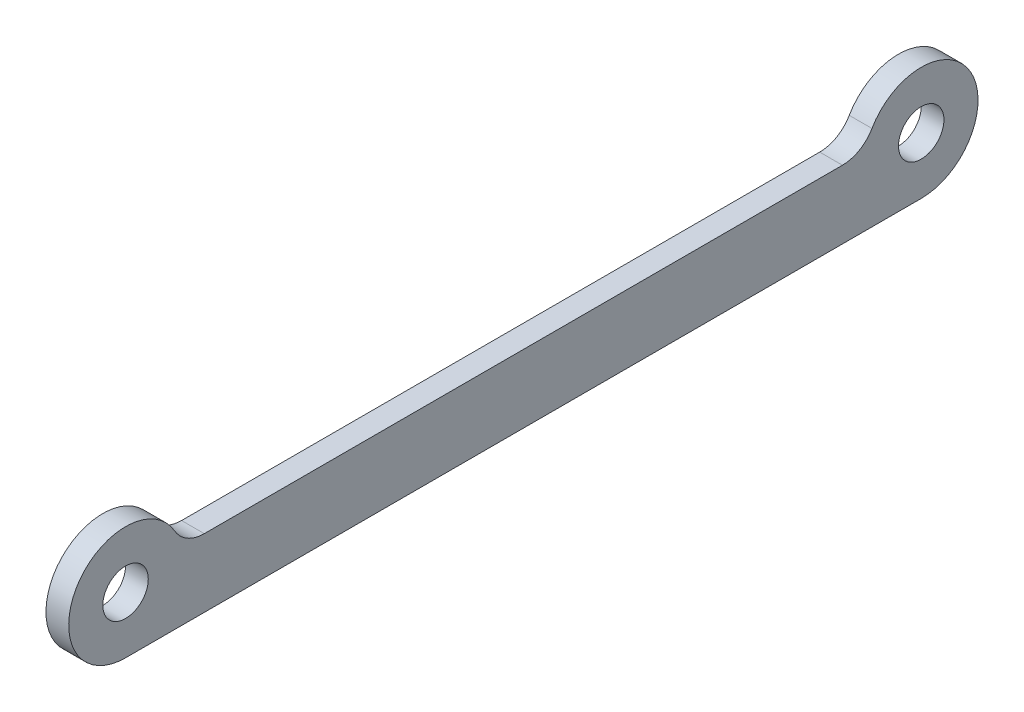
ISO-10303-21;
HEADER;
FILE_DESCRIPTION(('STEP AP214'),'2;1');
FILE_NAME('part.step','',(''),(''),'','','');
FILE_SCHEMA(('AUTOMOTIVE_DESIGN { 1 0 10303 214 1 1 1 1 }'));
ENDSEC;
DATA;
#1=APPLICATION_CONTEXT('core data for automotive mechanical design processes');
#2=APPLICATION_PROTOCOL_DEFINITION('international standard','automotive_design',2000,#1);
#3=PRODUCT_CONTEXT('',#1,'mechanical');
#4=PRODUCT('Part','Part','',(#3));
#5=PRODUCT_RELATED_PRODUCT_CATEGORY('part','',(#4));
#6=PRODUCT_DEFINITION_FORMATION('','',#4);
#7=PRODUCT_DEFINITION_CONTEXT('part definition',#1,'design');
#8=PRODUCT_DEFINITION('design','',#6,#7);
#9=PRODUCT_DEFINITION_SHAPE('','',#8);
#10=(LENGTH_UNIT() NAMED_UNIT(*) SI_UNIT(.MILLI.,.METRE.));
#11=(NAMED_UNIT(*) PLANE_ANGLE_UNIT() SI_UNIT($,.RADIAN.));
#12=(NAMED_UNIT(*) SI_UNIT($,.STERADIAN.) SOLID_ANGLE_UNIT());
#13=UNCERTAINTY_MEASURE_WITH_UNIT(LENGTH_MEASURE(1.E-05),#10,'distance_accuracy_value','');
#14=(GEOMETRIC_REPRESENTATION_CONTEXT(3) GLOBAL_UNCERTAINTY_ASSIGNED_CONTEXT((#13)) GLOBAL_UNIT_ASSIGNED_CONTEXT((#10,
#11,#12)) REPRESENTATION_CONTEXT('',''));
#15=CARTESIAN_POINT('',(0.,0.,0.));
#16=DIRECTION('',(0.,0.,1.));
#17=DIRECTION('',(1.,0.,0.));
#18=AXIS2_PLACEMENT_3D('',#15,#16,#17);
#19=CARTESIAN_POINT('',(2.,0.,0.));
#20=DIRECTION('',(0.,1.,0.));
#21=DIRECTION('',(0.,0.,1.));
#22=AXIS2_PLACEMENT_3D('',#19,#20,#21);
#23=PLANE('',#22);
#24=DIRECTION('',(0.,0.,-1.));
#25=VECTOR('',#24,1.);
#26=CARTESIAN_POINT('',(2.,0.,0.));
#27=LINE('',#26,#25);
#28=CARTESIAN_POINT('',(2.,0.,-6.92820323027551));
#29=VERTEX_POINT('',#28);
#30=CARTESIAN_POINT('',(2.,0.,-63.0717967697245));
#31=VERTEX_POINT('',#30);
#32=EDGE_CURVE('E136',#29,#31,#27,.T.);
#33=ORIENTED_EDGE('',*,*,#32,.T.);
#34=DIRECTION('',(-1.,0.,0.));
#35=VECTOR('',#34,1.);
#36=CARTESIAN_POINT('',(2.,0.,-63.0717967697245));
#37=LINE('',#36,#35);
#38=CARTESIAN_POINT('',(0.,0.,-63.0717967697245));
#39=VERTEX_POINT('',#38);
#40=EDGE_CURVE('E158',#31,#39,#37,.T.);
#41=ORIENTED_EDGE('',*,*,#40,.T.);
#42=DIRECTION('',(0.,0.,-1.));
#43=VECTOR('',#42,1.);
#44=CARTESIAN_POINT('',(0.,0.,0.));
#45=LINE('',#44,#43);
#46=CARTESIAN_POINT('',(0.,0.,-6.92820323027551));
#47=VERTEX_POINT('',#46);
#48=EDGE_CURVE('E137',#47,#39,#45,.T.);
#49=ORIENTED_EDGE('',*,*,#48,.F.);
#50=DIRECTION('',(-1.,0.,0.));
#51=VECTOR('',#50,1.);
#52=CARTESIAN_POINT('',(2.,0.,-6.92820323027551));
#53=LINE('',#52,#51);
#54=EDGE_CURVE('E131',#47,#29,#53,.F.);
#55=ORIENTED_EDGE('',*,*,#54,.T.);
#56=EDGE_LOOP('',(#33,#41,#49,#55));
#57=FACE_BOUND('',#56,.T.);
#58=ADVANCED_FACE('F67',(#57),#23,.T.);
#59=CARTESIAN_POINT('',(2.,-6.,0.));
#60=DIRECTION('',(0.,1.,0.));
#61=DIRECTION('',(0.,0.,1.));
#62=AXIS2_PLACEMENT_3D('',#59,#60,#61);
#63=PLANE('',#62);
#64=DIRECTION('',(0.,0.,-1.));
#65=VECTOR('',#64,1.);
#66=CARTESIAN_POINT('',(0.,-6.,0.));
#67=LINE('',#66,#65);
#68=CARTESIAN_POINT('',(0.,-6.,0.));
#69=VERTEX_POINT('',#68);
#70=CARTESIAN_POINT('',(0.,-6.,-70.));
#71=VERTEX_POINT('',#70);
#72=EDGE_CURVE('E122',#69,#71,#67,.T.);
#73=ORIENTED_EDGE('',*,*,#72,.T.);
#74=DIRECTION('',(-1.,0.,0.));
#75=VECTOR('',#74,1.);
#76=CARTESIAN_POINT('',(2.,-6.,-70.));
#77=LINE('',#76,#75);
#78=CARTESIAN_POINT('',(2.,-6.,-70.));
#79=VERTEX_POINT('',#78);
#80=EDGE_CURVE('E132',#79,#71,#77,.T.);
#81=ORIENTED_EDGE('',*,*,#80,.F.);
#82=DIRECTION('',(0.,0.,-1.));
#83=VECTOR('',#82,1.);
#84=CARTESIAN_POINT('',(2.,-6.,0.));
#85=LINE('',#84,#83);
#86=CARTESIAN_POINT('',(2.,-6.,0.));
#87=VERTEX_POINT('',#86);
#88=EDGE_CURVE('E121',#87,#79,#85,.T.);
#89=ORIENTED_EDGE('',*,*,#88,.F.);
#90=DIRECTION('',(-1.,0.,0.));
#91=VECTOR('',#90,1.);
#92=CARTESIAN_POINT('',(2.,-6.,0.));
#93=LINE('',#92,#91);
#94=EDGE_CURVE('E126',#87,#69,#93,.T.);
#95=ORIENTED_EDGE('',*,*,#94,.T.);
#96=EDGE_LOOP('',(#73,#81,#89,#95));
#97=FACE_BOUND('',#96,.T.);
#98=ADVANCED_FACE('F134',(#97),#63,.F.);
#99=CARTESIAN_POINT('',(0.,0.,0.));
#100=DIRECTION('',(1.,0.,0.));
#101=DIRECTION('',(0.,0.,-1.));
#102=AXIS2_PLACEMENT_3D('',#99,#100,#101);
#103=PLANE('',#102);
#104=CARTESIAN_POINT('',(0.,-1.,0.));
#105=DIRECTION('',(1.,0.,0.));
#106=DIRECTION('',(0.,0.,-1.));
#107=AXIS2_PLACEMENT_3D('',#104,#105,#106);
#108=CIRCLE('',#107,2.);
#109=CARTESIAN_POINT('',(0.,-1.,-2.));
#110=VERTEX_POINT('',#109);
#111=EDGE_CURVE('E214',#110,#110,#108,.T.);
#112=ORIENTED_EDGE('',*,*,#111,.T.);
#113=EDGE_LOOP('',(#112));
#114=FACE_BOUND('',#113,.T.);
#115=CARTESIAN_POINT('',(0.,-1.,-70.));
#116=DIRECTION('',(1.,0.,0.));
#117=DIRECTION('',(0.,0.,-1.));
#118=AXIS2_PLACEMENT_3D('',#115,#116,#117);
#119=CIRCLE('',#118,2.);
#120=CARTESIAN_POINT('',(0.,-1.,-72.));
#121=VERTEX_POINT('',#120);
#122=EDGE_CURVE('E215',#121,#121,#119,.T.);
#123=ORIENTED_EDGE('',*,*,#122,.T.);
#124=EDGE_LOOP('',(#123));
#125=FACE_BOUND('',#124,.T.);
#126=ORIENTED_EDGE('',*,*,#72,.F.);
#127=CARTESIAN_POINT('',(0.,-1.,0.));
#128=DIRECTION('',(1.,0.,0.));
#129=DIRECTION('',(0.,0.,-1.));
#130=AXIS2_PLACEMENT_3D('',#127,#128,#129);
#131=CIRCLE('',#130,5.);
#132=CARTESIAN_POINT('',(0.,1.5,-4.33012701892219));
#133=VERTEX_POINT('',#132);
#134=EDGE_CURVE('E123',#133,#69,#131,.T.);
#135=ORIENTED_EDGE('',*,*,#134,.F.);
#136=CARTESIAN_POINT('',(0.,3.,-6.92820323027551));
#137=DIRECTION('',(1.,0.,0.));
#138=DIRECTION('',(0.,0.,-1.));
#139=AXIS2_PLACEMENT_3D('',#136,#137,#138);
#140=CIRCLE('',#139,3.);
#141=EDGE_CURVE('E12',#133,#47,#140,.T.);
#142=ORIENTED_EDGE('',*,*,#141,.T.);
#143=ORIENTED_EDGE('',*,*,#48,.T.);
#144=CARTESIAN_POINT('',(0.,3.,-63.0717967697245));
#145=DIRECTION('',(1.,0.,0.));
#146=DIRECTION('',(0.,0.,-1.));
#147=AXIS2_PLACEMENT_3D('',#144,#145,#146);
#148=CIRCLE('',#147,3.);
#149=CARTESIAN_POINT('',(0.,1.5,-65.6698729810778));
#150=VERTEX_POINT('',#149);
#151=EDGE_CURVE('E164',#39,#150,#148,.T.);
#152=ORIENTED_EDGE('',*,*,#151,.T.);
#153=CARTESIAN_POINT('',(0.,-1.,-70.));
#154=DIRECTION('',(1.,0.,0.));
#155=DIRECTION('',(0.,0.,-1.));
#156=AXIS2_PLACEMENT_3D('',#153,#154,#155);
#157=CIRCLE('',#156,5.);
#158=EDGE_CURVE('E152',#71,#150,#157,.T.);
#159=ORIENTED_EDGE('',*,*,#158,.F.);
#160=EDGE_LOOP('',(#126,#135,#142,#143,#152,#159));
#161=FACE_BOUND('',#160,.T.);
#162=ADVANCED_FACE('F177',(#114,#125,#161),#103,.F.);
#163=CARTESIAN_POINT('',(2.,0.,0.));
#164=DIRECTION('',(1.,0.,0.));
#165=DIRECTION('',(0.,0.,-1.));
#166=AXIS2_PLACEMENT_3D('',#163,#164,#165);
#167=PLANE('',#166);
#168=CARTESIAN_POINT('',(2.,-1.,0.));
#169=DIRECTION('',(1.,0.,0.));
#170=DIRECTION('',(0.,0.,-1.));
#171=AXIS2_PLACEMENT_3D('',#168,#169,#170);
#172=CIRCLE('',#171,2.);
#173=CARTESIAN_POINT('',(2.,-1.,-2.));
#174=VERTEX_POINT('',#173);
#175=EDGE_CURVE('E155',#174,#174,#172,.T.);
#176=ORIENTED_EDGE('',*,*,#175,.F.);
#177=EDGE_LOOP('',(#176));
#178=FACE_BOUND('',#177,.T.);
#179=CARTESIAN_POINT('',(2.,-1.,-70.));
#180=DIRECTION('',(1.,0.,0.));
#181=DIRECTION('',(0.,0.,-1.));
#182=AXIS2_PLACEMENT_3D('',#179,#180,#181);
#183=CIRCLE('',#182,2.);
#184=CARTESIAN_POINT('',(2.,-1.,-72.));
#185=VERTEX_POINT('',#184);
#186=EDGE_CURVE('E144',#185,#185,#183,.T.);
#187=ORIENTED_EDGE('',*,*,#186,.F.);
#188=EDGE_LOOP('',(#187));
#189=FACE_BOUND('',#188,.T.);
#190=ORIENTED_EDGE('',*,*,#32,.F.);
#191=CARTESIAN_POINT('',(2.,3.,-6.92820323027551));
#192=DIRECTION('',(1.,0.,0.));
#193=DIRECTION('',(0.,0.,-1.));
#194=AXIS2_PLACEMENT_3D('',#191,#192,#193);
#195=CIRCLE('',#194,3.);
#196=CARTESIAN_POINT('',(2.,1.5,-4.33012701892219));
#197=VERTEX_POINT('',#196);
#198=EDGE_CURVE('E75',#29,#197,#195,.F.);
#199=ORIENTED_EDGE('',*,*,#198,.T.);
#200=CARTESIAN_POINT('',(2.,-1.,0.));
#201=DIRECTION('',(1.,0.,0.));
#202=DIRECTION('',(0.,0.,-1.));
#203=AXIS2_PLACEMENT_3D('',#200,#201,#202);
#204=CIRCLE('',#203,5.);
#205=EDGE_CURVE('E116',#197,#87,#204,.T.);
#206=ORIENTED_EDGE('',*,*,#205,.T.);
#207=ORIENTED_EDGE('',*,*,#88,.T.);
#208=CARTESIAN_POINT('',(2.,-1.,-70.));
#209=DIRECTION('',(1.,0.,0.));
#210=DIRECTION('',(0.,0.,-1.));
#211=AXIS2_PLACEMENT_3D('',#208,#209,#210);
#212=CIRCLE('',#211,5.);
#213=CARTESIAN_POINT('',(2.,1.5,-65.6698729810778));
#214=VERTEX_POINT('',#213);
#215=EDGE_CURVE('E150',#79,#214,#212,.T.);
#216=ORIENTED_EDGE('',*,*,#215,.T.);
#217=CARTESIAN_POINT('',(2.,3.,-63.0717967697245));
#218=DIRECTION('',(1.,0.,0.));
#219=DIRECTION('',(0.,0.,-1.));
#220=AXIS2_PLACEMENT_3D('',#217,#218,#219);
#221=CIRCLE('',#220,3.);
#222=EDGE_CURVE('E166',#214,#31,#221,.F.);
#223=ORIENTED_EDGE('',*,*,#222,.T.);
#224=EDGE_LOOP('',(#190,#199,#206,#207,#216,#223));
#225=FACE_BOUND('',#224,.T.);
#226=ADVANCED_FACE('F118',(#178,#189,#225),#167,.T.);
#227=CARTESIAN_POINT('',(2.,-1.,-70.));
#228=DIRECTION('',(-1.,0.,0.));
#229=DIRECTION('',(0.,0.,1.));
#230=AXIS2_PLACEMENT_3D('',#227,#228,#229);
#231=CYLINDRICAL_SURFACE('',#230,5.);
#232=ORIENTED_EDGE('',*,*,#158,.T.);
#233=DIRECTION('',(-1.,0.,0.));
#234=VECTOR('',#233,1.);
#235=CARTESIAN_POINT('',(2.,1.5,-65.6698729810778));
#236=LINE('',#235,#234);
#237=EDGE_CURVE('E161',#150,#214,#236,.F.);
#238=ORIENTED_EDGE('',*,*,#237,.T.);
#239=ORIENTED_EDGE('',*,*,#215,.F.);
#240=ORIENTED_EDGE('',*,*,#80,.T.);
#241=EDGE_LOOP('',(#232,#238,#239,#240));
#242=FACE_BOUND('',#241,.T.);
#243=ADVANCED_FACE('F179',(#242),#231,.T.);
#244=CARTESIAN_POINT('',(2.,-1.,0.));
#245=DIRECTION('',(-1.,0.,0.));
#246=DIRECTION('',(0.,0.,1.));
#247=AXIS2_PLACEMENT_3D('',#244,#245,#246);
#248=CYLINDRICAL_SURFACE('',#247,5.);
#249=ORIENTED_EDGE('',*,*,#205,.F.);
#250=DIRECTION('',(-1.,0.,0.));
#251=VECTOR('',#250,1.);
#252=CARTESIAN_POINT('',(2.,1.5,-4.33012701892219));
#253=LINE('',#252,#251);
#254=EDGE_CURVE('E88',#197,#133,#253,.T.);
#255=ORIENTED_EDGE('',*,*,#254,.T.);
#256=ORIENTED_EDGE('',*,*,#134,.T.);
#257=ORIENTED_EDGE('',*,*,#94,.F.);
#258=EDGE_LOOP('',(#249,#255,#256,#257));
#259=FACE_BOUND('',#258,.T.);
#260=ADVANCED_FACE('F127',(#259),#248,.T.);
#261=CARTESIAN_POINT('',(2.,-1.,-70.));
#262=DIRECTION('',(-1.,0.,0.));
#263=DIRECTION('',(0.,0.,1.));
#264=AXIS2_PLACEMENT_3D('',#261,#262,#263);
#265=CYLINDRICAL_SURFACE('',#264,2.);
#266=ORIENTED_EDGE('',*,*,#186,.T.);
#267=EDGE_LOOP('',(#266));
#268=FACE_BOUND('',#267,.T.);
#269=ORIENTED_EDGE('',*,*,#122,.F.);
#270=EDGE_LOOP('',(#269));
#271=FACE_BOUND('',#270,.T.);
#272=ADVANCED_FACE('F186',(#268,#271),#265,.F.);
#273=CARTESIAN_POINT('',(2.,-1.,0.));
#274=DIRECTION('',(-1.,0.,0.));
#275=DIRECTION('',(0.,0.,1.));
#276=AXIS2_PLACEMENT_3D('',#273,#274,#275);
#277=CYLINDRICAL_SURFACE('',#276,2.);
#278=ORIENTED_EDGE('',*,*,#175,.T.);
#279=EDGE_LOOP('',(#278));
#280=FACE_BOUND('',#279,.T.);
#281=ORIENTED_EDGE('',*,*,#111,.F.);
#282=EDGE_LOOP('',(#281));
#283=FACE_BOUND('',#282,.T.);
#284=ADVANCED_FACE('F202',(#280,#283),#277,.F.);
#285=CARTESIAN_POINT('',(2.,3.,-63.0717967697245));
#286=DIRECTION('',(-1.,0.,0.));
#287=DIRECTION('',(0.,0.,1.));
#288=AXIS2_PLACEMENT_3D('',#285,#286,#287);
#289=CYLINDRICAL_SURFACE('',#288,3.);
#290=ORIENTED_EDGE('',*,*,#222,.F.);
#291=ORIENTED_EDGE('',*,*,#237,.F.);
#292=ORIENTED_EDGE('',*,*,#151,.F.);
#293=ORIENTED_EDGE('',*,*,#40,.F.);
#294=EDGE_LOOP('',(#290,#291,#292,#293));
#295=FACE_BOUND('',#294,.T.);
#296=ADVANCED_FACE('F174',(#295),#289,.F.);
#297=CARTESIAN_POINT('',(2.,3.,-6.92820323027551));
#298=DIRECTION('',(-1.,0.,0.));
#299=DIRECTION('',(0.,0.,1.));
#300=AXIS2_PLACEMENT_3D('',#297,#298,#299);
#301=CYLINDRICAL_SURFACE('',#300,3.);
#302=ORIENTED_EDGE('',*,*,#141,.F.);
#303=ORIENTED_EDGE('',*,*,#254,.F.);
#304=ORIENTED_EDGE('',*,*,#198,.F.);
#305=ORIENTED_EDGE('',*,*,#54,.F.);
#306=EDGE_LOOP('',(#302,#303,#304,#305));
#307=FACE_BOUND('',#306,.T.);
#308=ADVANCED_FACE('F69',(#307),#301,.F.);
#309=CLOSED_SHELL('',(#58,#98,#162,#226,#243,#260,#272,#284,#296,#308));
#310=MANIFOLD_SOLID_BREP('B2',#309);
#311=ADVANCED_BREP_SHAPE_REPRESENTATION('',(#18,#310),#14);
#312=SHAPE_DEFINITION_REPRESENTATION(#9,#311);
ENDSEC;
END-ISO-10303-21;
